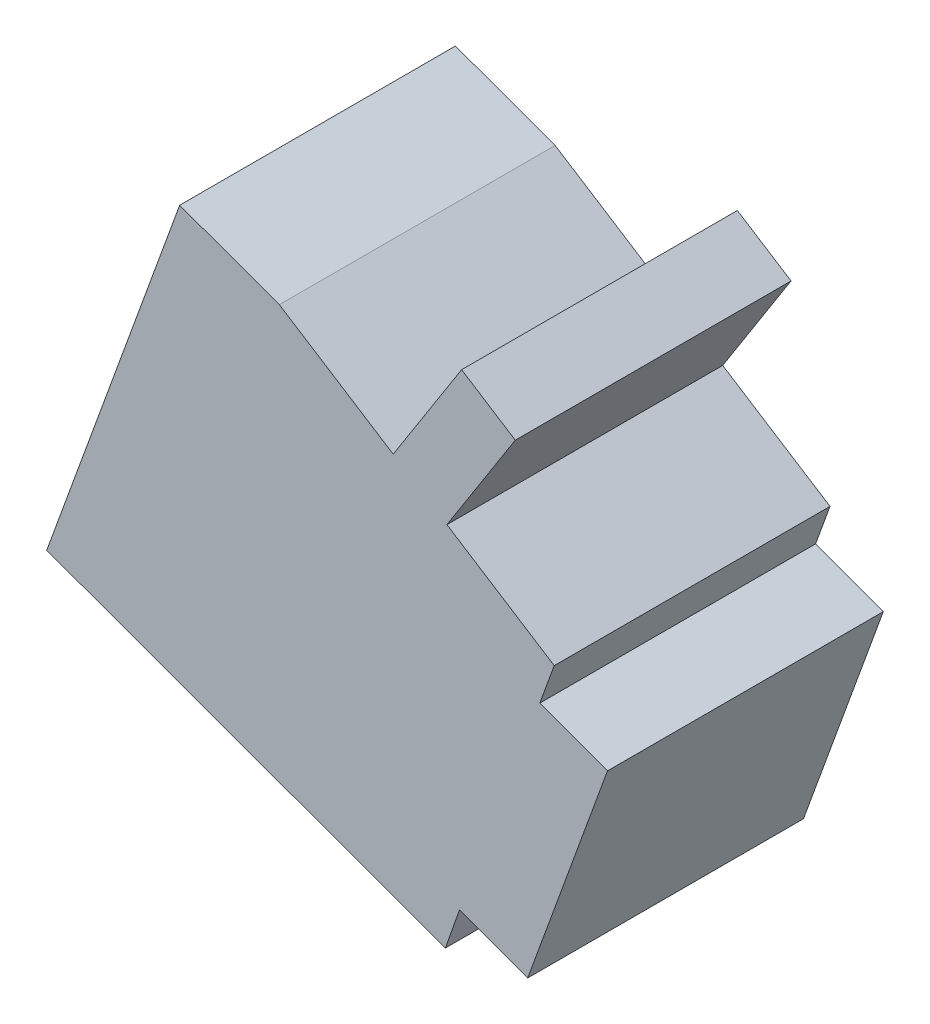
ISO-10303-21;
HEADER;
FILE_DESCRIPTION(('STEP AP214'),'2;1');
FILE_NAME('part.step','',(''),(''),'','','');
FILE_SCHEMA(('AUTOMOTIVE_DESIGN { 1 0 10303 214 1 1 1 1 }'));
ENDSEC;
DATA;
#1=APPLICATION_CONTEXT('core data for automotive mechanical design processes');
#2=APPLICATION_PROTOCOL_DEFINITION('international standard','automotive_design',2000,#1);
#3=PRODUCT_CONTEXT('',#1,'mechanical');
#4=PRODUCT('Part','Part','',(#3));
#5=PRODUCT_RELATED_PRODUCT_CATEGORY('part','',(#4));
#6=PRODUCT_DEFINITION_FORMATION('','',#4);
#7=PRODUCT_DEFINITION_CONTEXT('part definition',#1,'design');
#8=PRODUCT_DEFINITION('design','',#6,#7);
#9=PRODUCT_DEFINITION_SHAPE('','',#8);
#10=(LENGTH_UNIT() NAMED_UNIT(*) SI_UNIT(.MILLI.,.METRE.));
#11=(NAMED_UNIT(*) PLANE_ANGLE_UNIT() SI_UNIT($,.RADIAN.));
#12=(NAMED_UNIT(*) SI_UNIT($,.STERADIAN.) SOLID_ANGLE_UNIT());
#13=UNCERTAINTY_MEASURE_WITH_UNIT(LENGTH_MEASURE(1.E-05),#10,'distance_accuracy_value','');
#14=(GEOMETRIC_REPRESENTATION_CONTEXT(3) GLOBAL_UNCERTAINTY_ASSIGNED_CONTEXT((#13)) GLOBAL_UNIT_ASSIGNED_CONTEXT((#10,
#11,#12)) REPRESENTATION_CONTEXT('',''));
#15=CARTESIAN_POINT('',(0.,0.,0.));
#16=DIRECTION('',(0.,0.,1.));
#17=DIRECTION('',(1.,0.,0.));
#18=AXIS2_PLACEMENT_3D('',#15,#16,#17);
#19=CARTESIAN_POINT('',(2.72098238812966,17.5971888476533,67.31));
#20=DIRECTION('',(0.939692620785906,-0.342020143325674,0.));
#21=DIRECTION('',(0.342020143325674,0.939692620785906,0.));
#22=AXIS2_PLACEMENT_3D('',#19,#20,#21);
#23=PLANE('',#22);
#24=DIRECTION('',(-0.342020143325674,-0.939692620785906,0.));
#25=VECTOR('',#24,1.);
#26=CARTESIAN_POINT('',(2.72098238812966,17.5971888476533,50.8));
#27=LINE('',#26,#25);
#28=CARTESIAN_POINT('',(10.6809140860401,39.466921448063,50.8));
#29=VERTEX_POINT('',#28);
#30=CARTESIAN_POINT('',(2.72098238812966,17.5971888476533,50.8));
#31=VERTEX_POINT('',#30);
#32=EDGE_CURVE('E129',#29,#31,#27,.T.);
#33=ORIENTED_EDGE('',*,*,#32,.T.);
#34=DIRECTION('',(0.,0.,-1.));
#35=VECTOR('',#34,1.);
#36=CARTESIAN_POINT('',(2.72098238812966,17.5971888476533,67.31));
#37=LINE('',#36,#35);
#38=CARTESIAN_POINT('',(2.72098238812966,17.5971888476533,67.31));
#39=VERTEX_POINT('',#38);
#40=EDGE_CURVE('E11',#39,#31,#37,.T.);
#41=ORIENTED_EDGE('',*,*,#40,.F.);
#42=DIRECTION('',(-0.342020143325674,-0.939692620785906,0.));
#43=VECTOR('',#42,1.);
#44=CARTESIAN_POINT('',(2.72098238812966,17.5971888476533,67.31));
#45=LINE('',#44,#43);
#46=CARTESIAN_POINT('',(10.6809140860401,39.466921448063,67.31));
#47=VERTEX_POINT('',#46);
#48=EDGE_CURVE('E133',#47,#39,#45,.T.);
#49=ORIENTED_EDGE('',*,*,#48,.F.);
#50=DIRECTION('',(0.,0.,-1.));
#51=VECTOR('',#50,1.);
#52=CARTESIAN_POINT('',(10.6809140860401,39.466921448063,67.31));
#53=LINE('',#52,#51);
#54=EDGE_CURVE('E146',#47,#29,#53,.T.);
#55=ORIENTED_EDGE('',*,*,#54,.T.);
#56=EDGE_LOOP('',(#33,#41,#49,#55));
#57=FACE_BOUND('',#56,.T.);
#58=ADVANCED_FACE('F33',(#57),#23,.F.);
#59=CARTESIAN_POINT('',(26.5891749560917,8.90987720718114,67.31));
#60=DIRECTION('',(0.342020143325674,0.939692620785907,0.));
#61=DIRECTION('',(-0.939692620785907,0.342020143325674,0.));
#62=AXIS2_PLACEMENT_3D('',#59,#60,#61);
#63=PLANE('',#62);
#64=DIRECTION('',(0.939692620785906,-0.342020143325674,0.));
#65=VECTOR('',#64,1.);
#66=CARTESIAN_POINT('',(26.5891749560917,8.90987720718114,50.8));
#67=LINE('',#66,#65);
#68=CARTESIAN_POINT('',(26.5891749560917,8.90987720718114,50.8));
#69=VERTEX_POINT('',#68);
#70=EDGE_CURVE('E187',#31,#69,#67,.T.);
#71=ORIENTED_EDGE('',*,*,#70,.T.);
#72=DIRECTION('',(0.,0.,-1.));
#73=VECTOR('',#72,1.);
#74=CARTESIAN_POINT('',(26.5891749560917,8.90987720718114,67.31));
#75=LINE('',#74,#73);
#76=CARTESIAN_POINT('',(26.5891749560917,8.90987720718114,67.31));
#77=VERTEX_POINT('',#76);
#78=EDGE_CURVE('E41',#77,#69,#75,.T.);
#79=ORIENTED_EDGE('',*,*,#78,.F.);
#80=DIRECTION('',(0.939692620785906,-0.342020143325674,0.));
#81=VECTOR('',#80,1.);
#82=CARTESIAN_POINT('',(26.5891749560917,8.90987720718114,67.31));
#83=LINE('',#82,#81);
#84=EDGE_CURVE('E186',#39,#77,#83,.T.);
#85=ORIENTED_EDGE('',*,*,#84,.F.);
#86=ORIENTED_EDGE('',*,*,#40,.T.);
#87=EDGE_LOOP('',(#71,#79,#85,#86));
#88=FACE_BOUND('',#87,.T.);
#89=ADVANCED_FACE('F185',(#88),#63,.F.);
#90=CARTESIAN_POINT('',(27.4307878496081,11.3065667072553,67.31));
#91=DIRECTION('',(-0.943517647033136,0.331322274737234,0.));
#92=DIRECTION('',(-0.331322274737234,-0.943517647033136,0.));
#93=AXIS2_PLACEMENT_3D('',#90,#91,#92);
#94=PLANE('',#93);
#95=DIRECTION('',(0.331322274737234,0.943517647033136,0.));
#96=VECTOR('',#95,1.);
#97=CARTESIAN_POINT('',(27.4307878496081,11.3065667072553,50.8));
#98=LINE('',#97,#96);
#99=CARTESIAN_POINT('',(27.4307878496081,11.3065667072553,50.8));
#100=VERTEX_POINT('',#99);
#101=EDGE_CURVE('E181',#69,#100,#98,.T.);
#102=ORIENTED_EDGE('',*,*,#101,.T.);
#103=DIRECTION('',(0.,0.,-1.));
#104=VECTOR('',#103,1.);
#105=CARTESIAN_POINT('',(27.4307878496081,11.3065667072553,67.31));
#106=LINE('',#105,#104);
#107=CARTESIAN_POINT('',(27.4307878496081,11.3065667072553,67.31));
#108=VERTEX_POINT('',#107);
#109=EDGE_CURVE('E172',#108,#100,#106,.T.);
#110=ORIENTED_EDGE('',*,*,#109,.F.);
#111=DIRECTION('',(0.331322274737234,0.943517647033136,0.));
#112=VECTOR('',#111,1.);
#113=CARTESIAN_POINT('',(27.4307878496081,11.3065667072553,67.31));
#114=LINE('',#113,#112);
#115=EDGE_CURVE('E182',#77,#108,#114,.T.);
#116=ORIENTED_EDGE('',*,*,#115,.F.);
#117=ORIENTED_EDGE('',*,*,#78,.T.);
#118=EDGE_LOOP('',(#102,#110,#116,#117));
#119=FACE_BOUND('',#118,.T.);
#120=ADVANCED_FACE('F179',(#119),#94,.F.);
#121=CARTESIAN_POINT('',(31.5154988566924,9.81985348509709,67.31));
#122=DIRECTION('',(0.342020143325674,0.939692620785906,0.));
#123=DIRECTION('',(-0.939692620785906,0.342020143325674,0.));
#124=AXIS2_PLACEMENT_3D('',#121,#122,#123);
#125=PLANE('',#124);
#126=DIRECTION('',(0.939692620785907,-0.342020143325674,0.));
#127=VECTOR('',#126,1.);
#128=CARTESIAN_POINT('',(31.5154988566924,9.81985348509709,50.8));
#129=LINE('',#128,#127);
#130=CARTESIAN_POINT('',(31.5154988566924,9.81985348509709,50.8));
#131=VERTEX_POINT('',#130);
#132=EDGE_CURVE('E190',#100,#131,#129,.T.);
#133=ORIENTED_EDGE('',*,*,#132,.T.);
#134=DIRECTION('',(0.,0.,-1.));
#135=VECTOR('',#134,1.);
#136=CARTESIAN_POINT('',(31.5154988566924,9.81985348509709,67.31));
#137=LINE('',#136,#135);
#138=CARTESIAN_POINT('',(31.5154988566924,9.81985348509709,67.31));
#139=VERTEX_POINT('',#138);
#140=EDGE_CURVE('E169',#139,#131,#137,.T.);
#141=ORIENTED_EDGE('',*,*,#140,.F.);
#142=DIRECTION('',(0.939692620785907,-0.342020143325674,0.));
#143=VECTOR('',#142,1.);
#144=CARTESIAN_POINT('',(31.5154988566924,9.81985348509709,67.31));
#145=LINE('',#144,#143);
#146=EDGE_CURVE('E252',#108,#139,#145,.T.);
#147=ORIENTED_EDGE('',*,*,#146,.F.);
#148=ORIENTED_EDGE('',*,*,#109,.T.);
#149=EDGE_LOOP('',(#133,#141,#147,#148));
#150=FACE_BOUND('',#149,.T.);
#151=ADVANCED_FACE('F250',(#150),#125,.F.);
#152=CARTESIAN_POINT('',(36.2935202589521,22.9473593974762,67.31));
#153=DIRECTION('',(-0.939692620785906,0.342020143325674,0.));
#154=DIRECTION('',(-0.342020143325674,-0.939692620785906,0.));
#155=AXIS2_PLACEMENT_3D('',#152,#153,#154);
#156=PLANE('',#155);
#157=DIRECTION('',(0.342020143325674,0.939692620785907,0.));
#158=VECTOR('',#157,1.);
#159=CARTESIAN_POINT('',(36.2935202589521,22.9473593974762,50.8));
#160=LINE('',#159,#158);
#161=CARTESIAN_POINT('',(36.2935202589521,22.9473593974762,50.8));
#162=VERTEX_POINT('',#161);
#163=EDGE_CURVE('E197',#131,#162,#160,.T.);
#164=ORIENTED_EDGE('',*,*,#163,.T.);
#165=DIRECTION('',(0.,0.,-1.));
#166=VECTOR('',#165,1.);
#167=CARTESIAN_POINT('',(36.2935202589521,22.9473593974762,67.31));
#168=LINE('',#167,#166);
#169=CARTESIAN_POINT('',(36.2935202589521,22.9473593974762,67.31));
#170=VERTEX_POINT('',#169);
#171=EDGE_CURVE('E166',#170,#162,#168,.T.);
#172=ORIENTED_EDGE('',*,*,#171,.F.);
#173=DIRECTION('',(0.342020143325674,0.939692620785907,0.));
#174=VECTOR('',#173,1.);
#175=CARTESIAN_POINT('',(36.2935202589521,22.9473593974762,67.31));
#176=LINE('',#175,#174);
#177=EDGE_CURVE('E247',#139,#170,#176,.T.);
#178=ORIENTED_EDGE('',*,*,#177,.F.);
#179=ORIENTED_EDGE('',*,*,#140,.T.);
#180=EDGE_LOOP('',(#164,#172,#178,#179));
#181=FACE_BOUND('',#180,.T.);
#182=ADVANCED_FACE('F246',(#181),#156,.F.);
#183=CARTESIAN_POINT('',(32.2389763793897,24.4325790420947,67.31));
#184=DIRECTION('',(-0.343959351478395,-0.938984539026369,0.));
#185=DIRECTION('',(0.938984539026369,-0.343959351478395,0.));
#186=AXIS2_PLACEMENT_3D('',#183,#184,#185);
#187=PLANE('',#186);
#188=DIRECTION('',(-0.938984539026369,0.343959351478395,0.));
#189=VECTOR('',#188,1.);
#190=CARTESIAN_POINT('',(32.2389763793897,24.4325790420947,50.8));
#191=LINE('',#190,#189);
#192=CARTESIAN_POINT('',(32.2389763793897,24.4325790420947,50.8));
#193=VERTEX_POINT('',#192);
#194=EDGE_CURVE('E200',#162,#193,#191,.T.);
#195=ORIENTED_EDGE('',*,*,#194,.T.);
#196=DIRECTION('',(0.,0.,-1.));
#197=VECTOR('',#196,1.);
#198=CARTESIAN_POINT('',(32.2389763793897,24.4325790420947,67.31));
#199=LINE('',#198,#197);
#200=CARTESIAN_POINT('',(32.2389763793897,24.4325790420947,67.31));
#201=VERTEX_POINT('',#200);
#202=EDGE_CURVE('E163',#201,#193,#199,.T.);
#203=ORIENTED_EDGE('',*,*,#202,.F.);
#204=DIRECTION('',(-0.938984539026369,0.343959351478395,0.));
#205=VECTOR('',#204,1.);
#206=CARTESIAN_POINT('',(32.2389763793897,24.4325790420947,67.31));
#207=LINE('',#206,#205);
#208=EDGE_CURVE('E243',#170,#201,#207,.T.);
#209=ORIENTED_EDGE('',*,*,#208,.F.);
#210=ORIENTED_EDGE('',*,*,#171,.T.);
#211=EDGE_LOOP('',(#195,#203,#209,#210));
#212=FACE_BOUND('',#211,.T.);
#213=ADVANCED_FACE('F240',(#212),#187,.F.);
#214=CARTESIAN_POINT('',(33.1046586864458,26.8110216331527,67.31));
#215=DIRECTION('',(-0.939692620785906,0.342020143325674,0.));
#216=DIRECTION('',(-0.342020143325674,-0.939692620785906,0.));
#217=AXIS2_PLACEMENT_3D('',#214,#215,#216);
#218=PLANE('',#217);
#219=DIRECTION('',(0.342020143325674,0.939692620785906,0.));
#220=VECTOR('',#219,1.);
#221=CARTESIAN_POINT('',(33.1046586864458,26.8110216331527,50.8));
#222=LINE('',#221,#220);
#223=CARTESIAN_POINT('',(33.1046586864458,26.8110216331527,50.8));
#224=VERTEX_POINT('',#223);
#225=EDGE_CURVE('E203',#193,#224,#222,.T.);
#226=ORIENTED_EDGE('',*,*,#225,.T.);
#227=DIRECTION('',(0.,0.,-1.));
#228=VECTOR('',#227,1.);
#229=CARTESIAN_POINT('',(33.1046586864458,26.8110216331527,67.31));
#230=LINE('',#229,#228);
#231=CARTESIAN_POINT('',(33.1046586864458,26.8110216331527,67.31));
#232=VERTEX_POINT('',#231);
#233=EDGE_CURVE('E160',#232,#224,#230,.T.);
#234=ORIENTED_EDGE('',*,*,#233,.F.);
#235=DIRECTION('',(0.342020143325674,0.939692620785906,0.));
#236=VECTOR('',#235,1.);
#237=CARTESIAN_POINT('',(33.1046586864458,26.8110216331527,67.31));
#238=LINE('',#237,#236);
#239=EDGE_CURVE('E237',#201,#232,#238,.T.);
#240=ORIENTED_EDGE('',*,*,#239,.F.);
#241=ORIENTED_EDGE('',*,*,#202,.T.);
#242=EDGE_LOOP('',(#226,#234,#240,#241));
#243=FACE_BOUND('',#242,.T.);
#244=ADVANCED_FACE('F236',(#243),#218,.F.);
#245=CARTESIAN_POINT('',(26.6780158693516,30.9052446487555,67.31));
#246=DIRECTION('',(-0.537299608346825,-0.843391445812885,0.));
#247=DIRECTION('',(0.843391445812885,-0.537299608346825,0.));
#248=AXIS2_PLACEMENT_3D('',#245,#246,#247);
#249=PLANE('',#248);
#250=DIRECTION('',(-0.843391445812885,0.537299608346825,0.));
#251=VECTOR('',#250,1.);
#252=CARTESIAN_POINT('',(26.6780158693516,30.9052446487555,50.8));
#253=LINE('',#252,#251);
#254=CARTESIAN_POINT('',(26.6780158693516,30.9052446487555,50.8));
#255=VERTEX_POINT('',#254);
#256=EDGE_CURVE('E206',#224,#255,#253,.T.);
#257=ORIENTED_EDGE('',*,*,#256,.T.);
#258=DIRECTION('',(0.,0.,-1.));
#259=VECTOR('',#258,1.);
#260=CARTESIAN_POINT('',(26.6780158693516,30.9052446487555,67.31));
#261=LINE('',#260,#259);
#262=CARTESIAN_POINT('',(26.6780158693516,30.9052446487555,67.31));
#263=VERTEX_POINT('',#262);
#264=EDGE_CURVE('E157',#263,#255,#261,.T.);
#265=ORIENTED_EDGE('',*,*,#264,.F.);
#266=DIRECTION('',(-0.843391445812885,0.537299608346825,0.));
#267=VECTOR('',#266,1.);
#268=CARTESIAN_POINT('',(26.6780158693516,30.9052446487555,67.31));
#269=LINE('',#268,#267);
#270=EDGE_CURVE('E233',#232,#263,#269,.T.);
#271=ORIENTED_EDGE('',*,*,#270,.F.);
#272=ORIENTED_EDGE('',*,*,#233,.T.);
#273=EDGE_LOOP('',(#257,#265,#271,#272));
#274=FACE_BOUND('',#273,.T.);
#275=ADVANCED_FACE('F230',(#274),#249,.F.);
#276=CARTESIAN_POINT('',(30.7722388849544,37.3318874658497,67.31));
#277=DIRECTION('',(-0.843391445812884,0.537299608346826,0.));
#278=DIRECTION('',(-0.537299608346826,-0.843391445812884,0.));
#279=AXIS2_PLACEMENT_3D('',#276,#277,#278);
#280=PLANE('',#279);
#281=DIRECTION('',(0.537299608346826,0.843391445812884,0.));
#282=VECTOR('',#281,1.);
#283=CARTESIAN_POINT('',(30.7722388849544,37.3318874658497,50.8));
#284=LINE('',#283,#282);
#285=CARTESIAN_POINT('',(30.7722388849544,37.3318874658497,50.8));
#286=VERTEX_POINT('',#285);
#287=EDGE_CURVE('E209',#255,#286,#284,.T.);
#288=ORIENTED_EDGE('',*,*,#287,.T.);
#289=DIRECTION('',(0.,0.,-1.));
#290=VECTOR('',#289,1.);
#291=CARTESIAN_POINT('',(30.7722388849544,37.3318874658497,67.31));
#292=LINE('',#291,#290);
#293=CARTESIAN_POINT('',(30.7722388849544,37.3318874658497,67.31));
#294=VERTEX_POINT('',#293);
#295=EDGE_CURVE('E154',#294,#286,#292,.T.);
#296=ORIENTED_EDGE('',*,*,#295,.F.);
#297=DIRECTION('',(0.537299608346826,0.843391445812884,0.));
#298=VECTOR('',#297,1.);
#299=CARTESIAN_POINT('',(30.7722388849544,37.3318874658497,67.31));
#300=LINE('',#299,#298);
#301=EDGE_CURVE('E227',#263,#294,#300,.T.);
#302=ORIENTED_EDGE('',*,*,#301,.F.);
#303=ORIENTED_EDGE('',*,*,#264,.T.);
#304=EDGE_LOOP('',(#288,#296,#302,#303));
#305=FACE_BOUND('',#304,.T.);
#306=ADVANCED_FACE('F226',(#305),#280,.F.);
#307=CARTESIAN_POINT('',(27.5589174764073,39.3789989736511,67.31));
#308=DIRECTION('',(-0.537299608346826,-0.843391445812884,0.));
#309=DIRECTION('',(0.843391445812884,-0.537299608346826,0.));
#310=AXIS2_PLACEMENT_3D('',#307,#308,#309);
#311=PLANE('',#310);
#312=DIRECTION('',(-0.843391445812884,0.537299608346826,0.));
#313=VECTOR('',#312,1.);
#314=CARTESIAN_POINT('',(27.5589174764073,39.3789989736511,50.8));
#315=LINE('',#314,#313);
#316=CARTESIAN_POINT('',(27.5589174764073,39.3789989736511,50.8));
#317=VERTEX_POINT('',#316);
#318=EDGE_CURVE('E212',#286,#317,#315,.T.);
#319=ORIENTED_EDGE('',*,*,#318,.T.);
#320=DIRECTION('',(0.,0.,-1.));
#321=VECTOR('',#320,1.);
#322=CARTESIAN_POINT('',(27.5589174764073,39.3789989736511,67.31));
#323=LINE('',#322,#321);
#324=CARTESIAN_POINT('',(27.5589174764073,39.3789989736511,67.31));
#325=VERTEX_POINT('',#324);
#326=EDGE_CURVE('E148',#325,#317,#323,.T.);
#327=ORIENTED_EDGE('',*,*,#326,.F.);
#328=DIRECTION('',(-0.843391445812884,0.537299608346826,0.));
#329=VECTOR('',#328,1.);
#330=CARTESIAN_POINT('',(27.5589174764073,39.3789989736511,67.31));
#331=LINE('',#330,#329);
#332=EDGE_CURVE('E223',#294,#325,#331,.T.);
#333=ORIENTED_EDGE('',*,*,#332,.F.);
#334=ORIENTED_EDGE('',*,*,#295,.T.);
#335=EDGE_LOOP('',(#319,#327,#333,#334));
#336=FACE_BOUND('',#335,.T.);
#337=ADVANCED_FACE('F220',(#336),#311,.F.);
#338=CARTESIAN_POINT('',(23.4646944608045,32.9523561565569,67.31));
#339=DIRECTION('',(0.843391445812884,-0.537299608346827,0.));
#340=DIRECTION('',(0.537299608346827,0.843391445812884,0.));
#341=AXIS2_PLACEMENT_3D('',#338,#339,#340);
#342=PLANE('',#341);
#343=DIRECTION('',(-0.537299608346827,-0.843391445812884,0.));
#344=VECTOR('',#343,1.);
#345=CARTESIAN_POINT('',(23.4646944608045,32.9523561565569,50.8));
#346=LINE('',#345,#344);
#347=CARTESIAN_POINT('',(23.4646944608045,32.9523561565569,50.8));
#348=VERTEX_POINT('',#347);
#349=EDGE_CURVE('E143',#317,#348,#346,.T.);
#350=ORIENTED_EDGE('',*,*,#349,.T.);
#351=DIRECTION('',(0.,0.,-1.));
#352=VECTOR('',#351,1.);
#353=CARTESIAN_POINT('',(23.4646944608045,32.9523561565569,67.31));
#354=LINE('',#353,#352);
#355=CARTESIAN_POINT('',(23.4646944608045,32.9523561565569,67.31));
#356=VERTEX_POINT('',#355);
#357=EDGE_CURVE('E142',#356,#348,#354,.T.);
#358=ORIENTED_EDGE('',*,*,#357,.F.);
#359=DIRECTION('',(-0.537299608346827,-0.843391445812884,0.));
#360=VECTOR('',#359,1.);
#361=CARTESIAN_POINT('',(23.4646944608045,32.9523561565569,67.31));
#362=LINE('',#361,#360);
#363=EDGE_CURVE('E263',#325,#356,#362,.T.);
#364=ORIENTED_EDGE('',*,*,#363,.F.);
#365=ORIENTED_EDGE('',*,*,#326,.T.);
#366=EDGE_LOOP('',(#350,#358,#364,#365));
#367=FACE_BOUND('',#366,.T.);
#368=ADVANCED_FACE('F216',(#367),#342,.F.);
#369=CARTESIAN_POINT('',(16.6479622280307,37.295093537945,67.31));
#370=DIRECTION('',(-0.537299608346825,-0.843391445812885,0.));
#371=DIRECTION('',(0.843391445812885,-0.537299608346825,0.));
#372=AXIS2_PLACEMENT_3D('',#369,#370,#371);
#373=PLANE('',#372);
#374=DIRECTION('',(-0.843391445812885,0.537299608346825,0.));
#375=VECTOR('',#374,1.);
#376=CARTESIAN_POINT('',(16.6479622280307,37.295093537945,50.8));
#377=LINE('',#376,#375);
#378=CARTESIAN_POINT('',(16.6479622280307,37.295093537945,50.8));
#379=VERTEX_POINT('',#378);
#380=EDGE_CURVE('E126',#348,#379,#377,.T.);
#381=ORIENTED_EDGE('',*,*,#380,.T.);
#382=DIRECTION('',(0.,0.,-1.));
#383=VECTOR('',#382,1.);
#384=CARTESIAN_POINT('',(16.6479622280307,37.295093537945,67.31));
#385=LINE('',#384,#383);
#386=CARTESIAN_POINT('',(16.6479622280307,37.295093537945,67.31));
#387=VERTEX_POINT('',#386);
#388=EDGE_CURVE('E140',#387,#379,#385,.T.);
#389=ORIENTED_EDGE('',*,*,#388,.F.);
#390=DIRECTION('',(-0.843391445812885,0.537299608346825,0.));
#391=VECTOR('',#390,1.);
#392=CARTESIAN_POINT('',(16.6479622280307,37.295093537945,67.31));
#393=LINE('',#392,#391);
#394=EDGE_CURVE('E265',#356,#387,#393,.T.);
#395=ORIENTED_EDGE('',*,*,#394,.F.);
#396=ORIENTED_EDGE('',*,*,#357,.T.);
#397=EDGE_LOOP('',(#381,#389,#395,#396));
#398=FACE_BOUND('',#397,.T.);
#399=ADVANCED_FACE('F138',(#398),#373,.F.);
#400=CARTESIAN_POINT('',(10.6809140860401,39.466921448063,67.31));
#401=DIRECTION('',(-0.342020143325674,-0.939692620785907,0.));
#402=DIRECTION('',(0.939692620785907,-0.342020143325674,0.));
#403=AXIS2_PLACEMENT_3D('',#400,#401,#402);
#404=PLANE('',#403);
#405=DIRECTION('',(-0.939692620785906,0.342020143325674,0.));
#406=VECTOR('',#405,1.);
#407=CARTESIAN_POINT('',(10.6809140860401,39.466921448063,50.8));
#408=LINE('',#407,#406);
#409=EDGE_CURVE('E123',#379,#29,#408,.T.);
#410=ORIENTED_EDGE('',*,*,#409,.T.);
#411=ORIENTED_EDGE('',*,*,#54,.F.);
#412=DIRECTION('',(-0.939692620785906,0.342020143325674,0.));
#413=VECTOR('',#412,1.);
#414=CARTESIAN_POINT('',(10.6809140860401,39.466921448063,67.31));
#415=LINE('',#414,#413);
#416=EDGE_CURVE('E48',#387,#47,#415,.T.);
#417=ORIENTED_EDGE('',*,*,#416,.F.);
#418=ORIENTED_EDGE('',*,*,#388,.T.);
#419=EDGE_LOOP('',(#410,#411,#417,#418));
#420=FACE_BOUND('',#419,.T.);
#421=ADVANCED_FACE('F145',(#420),#404,.F.);
#422=CARTESIAN_POINT('',(10.6809140860401,39.466921448063,67.31));
#423=DIRECTION('',(0.,0.,-1.));
#424=DIRECTION('',(-1.,0.,0.));
#425=AXIS2_PLACEMENT_3D('',#422,#423,#424);
#426=PLANE('',#425);
#427=ORIENTED_EDGE('',*,*,#48,.T.);
#428=ORIENTED_EDGE('',*,*,#84,.T.);
#429=ORIENTED_EDGE('',*,*,#115,.T.);
#430=ORIENTED_EDGE('',*,*,#146,.T.);
#431=ORIENTED_EDGE('',*,*,#177,.T.);
#432=ORIENTED_EDGE('',*,*,#208,.T.);
#433=ORIENTED_EDGE('',*,*,#239,.T.);
#434=ORIENTED_EDGE('',*,*,#270,.T.);
#435=ORIENTED_EDGE('',*,*,#301,.T.);
#436=ORIENTED_EDGE('',*,*,#332,.T.);
#437=ORIENTED_EDGE('',*,*,#363,.T.);
#438=ORIENTED_EDGE('',*,*,#394,.T.);
#439=ORIENTED_EDGE('',*,*,#416,.T.);
#440=EDGE_LOOP('',(#427,#428,#429,#430,#431,#432,#433,#434,#435,#436,#437,#438,#439));
#441=FACE_BOUND('',#440,.T.);
#442=ADVANCED_FACE('F266',(#441),#426,.F.);
#443=CARTESIAN_POINT('',(203.2,508.,50.8));
#444=DIRECTION('',(0.,0.,1.));
#445=DIRECTION('',(1.,0.,0.));
#446=AXIS2_PLACEMENT_3D('',#443,#444,#445);
#447=PLANE('',#446);
#448=ORIENTED_EDGE('',*,*,#409,.F.);
#449=ORIENTED_EDGE('',*,*,#380,.F.);
#450=ORIENTED_EDGE('',*,*,#349,.F.);
#451=ORIENTED_EDGE('',*,*,#318,.F.);
#452=ORIENTED_EDGE('',*,*,#287,.F.);
#453=ORIENTED_EDGE('',*,*,#256,.F.);
#454=ORIENTED_EDGE('',*,*,#225,.F.);
#455=ORIENTED_EDGE('',*,*,#194,.F.);
#456=ORIENTED_EDGE('',*,*,#163,.F.);
#457=ORIENTED_EDGE('',*,*,#132,.F.);
#458=ORIENTED_EDGE('',*,*,#101,.F.);
#459=ORIENTED_EDGE('',*,*,#70,.F.);
#460=ORIENTED_EDGE('',*,*,#32,.F.);
#461=EDGE_LOOP('',(#448,#449,#450,#451,#452,#453,#454,#455,#456,#457,#458,#459,#460));
#462=FACE_BOUND('',#461,.T.);
#463=ADVANCED_FACE('F125',(#462),#447,.F.);
#464=CLOSED_SHELL('',(#58,#89,#120,#151,#182,#213,#244,#275,#306,#337,#368,#399,#421,#442,#463));
#465=MANIFOLD_SOLID_BREP('B2',#464);
#466=ADVANCED_BREP_SHAPE_REPRESENTATION('',(#18,#465),#14);
#467=SHAPE_DEFINITION_REPRESENTATION(#9,#466);
ENDSEC;
END-ISO-10303-21;
